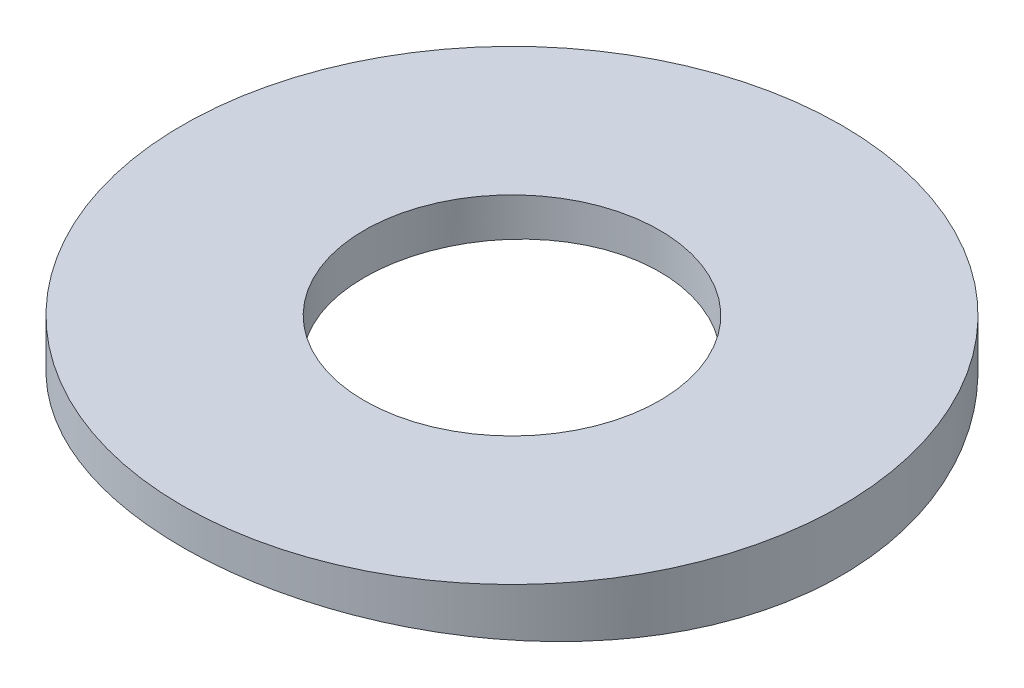
ISO-10303-21;
HEADER;
FILE_DESCRIPTION(('STEP AP214'),'2;1');
FILE_NAME('part.step','',(''),(''),'','','');
FILE_SCHEMA(('AUTOMOTIVE_DESIGN { 1 0 10303 214 1 1 1 1 }'));
ENDSEC;
DATA;
#1=APPLICATION_CONTEXT('core data for automotive mechanical design processes');
#2=APPLICATION_PROTOCOL_DEFINITION('international standard','automotive_design',2000,#1);
#3=PRODUCT_CONTEXT('',#1,'mechanical');
#4=PRODUCT('Part','Part','',(#3));
#5=PRODUCT_RELATED_PRODUCT_CATEGORY('part','',(#4));
#6=PRODUCT_DEFINITION_FORMATION('','',#4);
#7=PRODUCT_DEFINITION_CONTEXT('part definition',#1,'design');
#8=PRODUCT_DEFINITION('design','',#6,#7);
#9=PRODUCT_DEFINITION_SHAPE('','',#8);
#10=(LENGTH_UNIT() NAMED_UNIT(*) SI_UNIT(.MILLI.,.METRE.));
#11=(NAMED_UNIT(*) PLANE_ANGLE_UNIT() SI_UNIT($,.RADIAN.));
#12=(NAMED_UNIT(*) SI_UNIT($,.STERADIAN.) SOLID_ANGLE_UNIT());
#13=UNCERTAINTY_MEASURE_WITH_UNIT(LENGTH_MEASURE(1.E-05),#10,'distance_accuracy_value','');
#14=(GEOMETRIC_REPRESENTATION_CONTEXT(3) GLOBAL_UNCERTAINTY_ASSIGNED_CONTEXT((#13)) GLOBAL_UNIT_ASSIGNED_CONTEXT((#10,
#11,#12)) REPRESENTATION_CONTEXT('',''));
#15=CARTESIAN_POINT('',(0.,0.,0.));
#16=DIRECTION('',(0.,0.,1.));
#17=DIRECTION('',(1.,0.,0.));
#18=AXIS2_PLACEMENT_3D('',#15,#16,#17);
#19=CARTESIAN_POINT('',(0.,31.5,0.));
#20=DIRECTION('',(0.,-1.,0.));
#21=DIRECTION('',(0.,0.,-1.));
#22=AXIS2_PLACEMENT_3D('',#19,#20,#21);
#23=CYLINDRICAL_SURFACE('',#22,4.575);
#24=CARTESIAN_POINT('',(0.,31.5,0.));
#25=DIRECTION('',(0.,1.,0.));
#26=DIRECTION('',(0.,0.,1.));
#27=AXIS2_PLACEMENT_3D('',#24,#25,#26);
#28=CIRCLE('',#27,4.575);
#29=CARTESIAN_POINT('',(0.,31.5,4.575));
#30=VERTEX_POINT('',#29);
#31=EDGE_CURVE('E61',#30,#30,#28,.T.);
#32=ORIENTED_EDGE('',*,*,#31,.F.);
#33=EDGE_LOOP('',(#32));
#34=FACE_BOUND('',#33,.T.);
#35=CARTESIAN_POINT('',(0.,31.,-4.575));
#36=CARTESIAN_POINT('',(-0.2554910003045,30.9999959514671,-4.57498942727914));
#37=CARTESIAN_POINT('',(-0.511131445319186,30.9968083727082,-4.55352590453105));
#38=CARTESIAN_POINT('',(-1.01527014122844,30.9843992513034,-4.46825875179378));
#39=CARTESIAN_POINT('',(-1.26376113542093,30.9751717891014,-4.4044135836225));
#40=CARTESIAN_POINT('',(-1.74623180797945,30.9517201278143,-4.23632958735716));
#41=CARTESIAN_POINT('',(-1.9802221785734,30.9374996632285,-4.13212094299717));
#42=CARTESIAN_POINT('',(-2.42735841711655,30.9056344203031,-3.88634108468699));
#43=CARTESIAN_POINT('',(-2.64050724465526,30.8879901292268,-3.74477518622016));
#44=CARTESIAN_POINT('',(-3.04156047494433,30.851090760935,-3.42715686534273));
#45=CARTESIAN_POINT('',(-3.22928421145063,30.8318255877638,-3.25087746650293));
#46=CARTESIAN_POINT('',(-3.57259999407972,30.7939350267551,-2.86932443008993));
#47=CARTESIAN_POINT('',(-3.72819021529013,30.775309675304,-2.66404914690951));
#48=CARTESIAN_POINT('',(-4.00352263014604,30.7407095196694,-2.22912139014033));
#49=CARTESIAN_POINT('',(-4.12309057374814,30.724747760773,-1.99935747923341));
#50=CARTESIAN_POINT('',(-4.3218708640237,30.6974194624581,-1.52273370577321));
#51=CARTESIAN_POINT('',(-4.40108533921677,30.6860526806753,-1.27587474571085));
#52=CARTESIAN_POINT('',(-4.51635018627481,30.6693003320747,-0.773966020862406));
#53=CARTESIAN_POINT('',(-4.55270946203933,30.6638719812145,-0.518988650756318));
#54=CARTESIAN_POINT('',(-4.58218864584616,30.6594811293318,-0.00649832275634538));
#55=CARTESIAN_POINT('',(-4.57531095824467,30.6605182687711,0.251014493349298));
#56=CARTESIAN_POINT('',(-4.51876400602774,30.6689020858631,0.759086820297169));
#57=CARTESIAN_POINT('',(-4.46943838696208,30.6761980921386,1.0096855342892));
#58=CARTESIAN_POINT('',(-4.32993350258919,30.6961984265992,1.49901021244481));
#59=CARTESIAN_POINT('',(-4.23975311546973,30.7089029032925,1.7377358503913));
#60=CARTESIAN_POINT('',(-4.02073992924659,30.7383448329766,2.1975856894527));
#61=CARTESIAN_POINT('',(-3.89176117838949,30.755097466683,2.41863936621855));
#62=CARTESIAN_POINT('',(-3.59891648832446,30.790737064432,2.83609641158226));
#63=CARTESIAN_POINT('',(-3.43504833161624,30.8096241641011,3.03249821209477));
#64=CARTESIAN_POINT('',(-3.07518822254876,30.8476286254862,3.3970683359399));
#65=CARTESIAN_POINT('',(-2.87890073532812,30.8667464466931,3.56494503184529));
#66=CARTESIAN_POINT('',(-2.46078217750734,30.9028883783172,3.86541743511309));
#67=CARTESIAN_POINT('',(-2.2389510014331,30.9199124800886,3.99801299678639));
#68=CARTESIAN_POINT('',(-1.77579217284354,30.9499657902661,4.22417267729594));
#69=CARTESIAN_POINT('',(-1.5344535942218,30.9629927400001,4.31771473888214));
#70=CARTESIAN_POINT('',(-1.03925808416779,30.9835649384809,4.46286087993934));
#71=CARTESIAN_POINT('',(-0.78540197285658,30.9911105458448,4.51446770305229));
#72=CARTESIAN_POINT('',(-0.274894870116721,30.9998224717702,4.57389167934189));
#73=CARTESIAN_POINT('',(-0.0182915170781978,31.0010472074108,4.58210984397508));
#74=CARTESIAN_POINT('',(0.492629576607515,30.9971382773716,4.55558698867809));
#75=CARTESIAN_POINT('',(0.746947385453031,30.9920048020532,4.52084725488387));
#76=CARTESIAN_POINT('',(1.2448668502305,30.9759923981289,4.40972816928555));
#77=CARTESIAN_POINT('',(1.48851294885174,30.9651403743059,4.33354375369979));
#78=CARTESIAN_POINT('',(1.95957340578636,30.9389039241763,4.14190316617825));
#79=CARTESIAN_POINT('',(2.18698702246321,30.9235192909465,4.02644520128357));
#80=CARTESIAN_POINT('',(2.62089331422019,30.8897825938589,3.75859107938244));
#81=CARTESIAN_POINT('',(2.82722703825063,30.8714103565578,3.60594001928413));
#82=CARTESIAN_POINT('',(3.21149044715159,30.8338073415268,3.26838839389746));
#83=CARTESIAN_POINT('',(3.38941853574344,30.8145765156254,3.0834860174401));
#84=CARTESIAN_POINT('',(3.71327531393901,30.7772390360892,2.68489713512561));
#85=CARTESIAN_POINT('',(3.8589354926445,30.7591426529812,2.47099135409104));
#86=CARTESIAN_POINT('',(4.11225650038999,30.7263035784393,2.02151331596604));
#87=CARTESIAN_POINT('',(4.21991833007638,30.7115607986956,1.7859416296303));
#88=CARTESIAN_POINT('',(4.39376840573616,30.6871720916164,1.30062630958643));
#89=CARTESIAN_POINT('',(4.46009900246942,30.677508688369,1.05093458571281));
#90=CARTESIAN_POINT('',(4.54985739643946,30.6643260236724,0.543802286329639));
#91=CARTESIAN_POINT('',(4.57328805352877,30.6608063526623,0.286362228512805));
#92=CARTESIAN_POINT('',(4.57651504142164,30.6603246175224,-0.226283209634243));
#93=CARTESIAN_POINT('',(4.55673351670441,30.6632991110421,-0.481485973581096));
#94=CARTESIAN_POINT('',(4.47500118263479,30.6753328303599,-0.984893350049709));
#95=CARTESIAN_POINT('',(4.41305043235226,30.6843920476347,-1.23309797237383));
#96=CARTESIAN_POINT('',(4.24888572349468,30.7075525551431,-1.71535281673918));
#97=CARTESIAN_POINT('',(4.14670032588713,30.7216502680962,-1.94941294373971));
#98=CARTESIAN_POINT('',(3.90500888675399,30.7533038094898,-2.39713496874725));
#99=CARTESIAN_POINT('',(3.76550166327044,30.7708597474453,-2.61079622044431));
#100=CARTESIAN_POINT('',(3.45158942444308,30.8076559628315,-3.01380170721324));
#101=CARTESIAN_POINT('',(3.27687150885756,30.8269104037218,-3.2029009494146));
#102=CARTESIAN_POINT('',(2.89815849781536,30.8648151709598,-3.54924718410937));
#103=CARTESIAN_POINT('',(2.69415659822493,30.8834653556707,-3.70648675347512));
#104=CARTESIAN_POINT('',(2.2613923684426,30.9181732580888,-3.98539445352873));
#105=CARTESIAN_POINT('',(2.03250410608737,30.9342166584461,-4.1068689261941));
#106=CARTESIAN_POINT('',(1.55744703444295,30.9617626237764,-4.30946941217388));
#107=CARTESIAN_POINT('',(1.31129652152327,30.9732699134193,-4.39063743043832));
#108=CARTESIAN_POINT('',(0.886686189888459,30.9878048786693,-4.49180012975829));
#109=CARTESIAN_POINT('',(0.71085373370944,30.9923546896523,-4.52295270070283));
#110=CARTESIAN_POINT('',(0.356705117409544,30.9984536459428,-4.56455620435037));
#111=CARTESIAN_POINT('',(0.17838898671211,31.0000028267676,-4.57500738208766));
#112=CARTESIAN_POINT('',(0.,31.,-4.575));
#113=B_SPLINE_CURVE_WITH_KNOTS('',3,(#35,#36,#37,#38,#39,#40,#41,#42,#43,#44,#45,#46,#47,#48,
#49,#50,#51,#52,#53,#54,#55,#56,#57,#58,#59,#60,#61,#62,#63,#64,#65,#66,#67,#68,#69,#70,#71,#72,
#73,#74,#75,#76,#77,#78,#79,#80,#81,#82,#83,#84,#85,#86,#87,#88,#89,#90,#91,#92,#93,#94,#95,#96,
#97,#98,#99,#100,#101,#102,#103,#104,#105,#106,#107,#108,#109,#110,#111,#112),.UNSPECIFIED.,.T.,
.F.,(4,2,2,2,2,2,2,2,2,2,2,2,2,2,2,2,2,2,2,2,2,2,2,2,2,2,2,2,2,2,2,2,2,2,2,2,2,2,4),(0.,
0.76582117544931,1.53239404138176,2.29839476880629,3.06428656234827,3.83536323258159,
4.60648368142539,5.38127648413811,6.15602841471425,6.92516103606037,7.69425088723303,
8.45717237380156,9.22011481034904,9.98596395973874,10.7518617994945,11.525171714488,
12.2984848227203,13.0722341059569,13.8459327620353,14.6124679751197,15.3789802391152,
16.1419179767005,16.9048905494271,17.6732469922017,18.4416465982279,19.2162182774855,
19.9907695576939,20.7626382081474,21.5344554013981,22.2987663752704,23.0630762785122,
23.8268446040351,24.5906371204686,25.3615427619368,26.1326278141354,26.9078143703303,
27.6821913696349,28.216909541329,28.7516213837354),.UNSPECIFIED.);
#114=CARTESIAN_POINT('',(0.,31.,-4.575));
#115=VERTEX_POINT('',#114);
#116=EDGE_CURVE('E10',#115,#115,#113,.T.);
#117=ORIENTED_EDGE('',*,*,#116,.T.);
#118=EDGE_LOOP('',(#117));
#119=FACE_BOUND('',#118,.T.);
#120=ADVANCED_FACE('F47',(#34,#119),#23,.T.);
#121=CARTESIAN_POINT('',(0.,31.5,0.));
#122=DIRECTION('',(0.,1.,0.));
#123=DIRECTION('',(0.,0.,1.));
#124=AXIS2_PLACEMENT_3D('',#121,#122,#123);
#125=PLANE('',#124);
#126=CARTESIAN_POINT('',(0.,31.5,0.));
#127=DIRECTION('',(0.,1.,0.));
#128=DIRECTION('',(0.,0.,1.));
#129=AXIS2_PLACEMENT_3D('',#126,#127,#128);
#130=CIRCLE('',#129,2.05);
#131=CARTESIAN_POINT('',(0.,31.5,2.05));
#132=VERTEX_POINT('',#131);
#133=EDGE_CURVE('E68',#132,#132,#130,.T.);
#134=ORIENTED_EDGE('',*,*,#133,.F.);
#135=EDGE_LOOP('',(#134));
#136=FACE_BOUND('',#135,.T.);
#137=ORIENTED_EDGE('',*,*,#31,.T.);
#138=EDGE_LOOP('',(#137));
#139=FACE_BOUND('',#138,.T.);
#140=ADVANCED_FACE('F78',(#136,#139),#125,.T.);
#141=CARTESIAN_POINT('',(0.,0.,-4.575));
#142=DIRECTION('',(0.,0.,1.));
#143=DIRECTION('',(1.,0.,0.));
#144=AXIS2_PLACEMENT_3D('',#141,#142,#143);
#145=CYLINDRICAL_SURFACE('',#144,31.);
#146=CARTESIAN_POINT('',(0.,31.,2.05));
#147=CARTESIAN_POINT('',(0.11501455880049,30.9999991008757,2.04999494470167));
#148=CARTESIAN_POINT('',(0.230109307011351,30.9993530766339,2.04028819002266));
#149=CARTESIAN_POINT('',(0.457119790778304,30.9968380664879,2.00170589922599));
#150=CARTESIAN_POINT('',(0.569031684379498,30.9949676630199,1.97280814355729));
#151=CARTESIAN_POINT('',(0.786355408695936,30.9902154522158,1.89667836471327));
#152=CARTESIAN_POINT('',(0.891770671941916,30.9873341844559,1.84945612130809));
#153=CARTESIAN_POINT('',(1.09315123749258,30.9808841617825,1.73803395018302));
#154=CARTESIAN_POINT('',(1.18911867522083,30.9773155627632,1.67383787108235));
#155=CARTESIAN_POINT('',(1.36906588840227,30.9698852763245,1.53017395233868));
#156=CARTESIAN_POINT('',(1.45302789550881,30.9660231671792,1.4506838767879));
#157=CARTESIAN_POINT('',(1.60642881818263,30.9584447323024,1.27873448929213));
#158=CARTESIAN_POINT('',(1.67586712224877,30.9547284127145,1.18627463154548));
#159=CARTESIAN_POINT('',(1.79830546976372,30.9478573558154,0.990908137812628));
#160=CARTESIAN_POINT('',(1.85129056714963,30.944703130211,0.887992115421215));
#161=CARTESIAN_POINT('',(1.93922285297929,30.9393174892298,0.674700436500219));
#162=CARTESIAN_POINT('',(1.97417025444772,30.9370860629549,0.564324868085074));
#163=CARTESIAN_POINT('',(2.02498531560555,30.9338017172236,0.339419982831862));
#164=CARTESIAN_POINT('',(2.04088106133683,30.9327470631229,0.224897037501003));
#165=CARTESIAN_POINT('',(2.05322830138958,30.9319300034307,-0.00519604514331049));
#166=CARTESIAN_POINT('',(2.049680038122,30.9321675817287,-0.120766169383518));
#167=CARTESIAN_POINT('',(2.02326327160709,30.9339065850469,-0.349481454435292));
#168=CARTESIAN_POINT('',(2.0004251807948,30.9354060206032,-0.462630145133262));
#169=CARTESIAN_POINT('',(1.93612423291307,30.9394966357437,-0.683484471054567));
#170=CARTESIAN_POINT('',(1.89466125337955,30.9420878225065,-0.791190070482811));
#171=CARTESIAN_POINT('',(1.79425305717886,30.9480722289179,-0.998198433394656));
#172=CARTESIAN_POINT('',(1.73529406782164,30.9514660799873,-1.09749449752249));
#173=CARTESIAN_POINT('',(1.60157745266774,30.9586727380437,-1.28479189494925));
#174=CARTESIAN_POINT('',(1.52681962734306,30.9624855503217,-1.37279308557943));
#175=CARTESIAN_POINT('',(1.36345626247692,30.9701093028232,-1.53517963243204));
#176=CARTESIAN_POINT('',(1.27482440721175,30.9739202253923,-1.60953851803788));
#177=CARTESIAN_POINT('',(1.08632110083942,30.9811037185636,-1.74232542457822));
#178=CARTESIAN_POINT('',(0.986449645350404,30.9844762889948,-1.8007534393019));
#179=CARTESIAN_POINT('',(0.77828589050213,30.9904033679038,-1.90001789766522));
#180=CARTESIAN_POINT('',(0.669993099167028,30.9929578285429,-1.94085331262946));
#181=CARTESIAN_POINT('',(0.448067990111907,30.9969602178818,-2.00375559075384));
#182=CARTESIAN_POINT('',(0.334435742207698,30.9984081610456,-2.02582269924605));
#183=CARTESIAN_POINT('',(0.105286955680417,31.0000324968227,-2.05052910057569));
#184=CARTESIAN_POINT('',(-0.0102256213624804,31.0002112844107,-2.05320498604201));
#185=CARTESIAN_POINT('',(-0.240057949626237,30.9992835371937,-2.03914863187696));
#186=CARTESIAN_POINT('',(-0.3543777078036,30.998177009889,-2.02241650549676));
#187=CARTESIAN_POINT('',(-0.57847600275397,30.9948047215235,-1.9700493947536));
#188=CARTESIAN_POINT('',(-0.688258485729511,30.9925399917369,-1.93443122566273));
#189=CARTESIAN_POINT('',(-0.900287775610134,30.9871060283781,-1.84532019150623));
#190=CARTESIAN_POINT('',(-1.00253450671351,30.9839367857089,-1.79182714666815));
#191=CARTESIAN_POINT('',(-1.19675729405963,30.977043804002,-1.66839186438793));
#192=CARTESIAN_POINT('',(-1.28871780796917,30.9733192451807,-1.59842521787902));
#193=CARTESIAN_POINT('',(-1.45960121229114,30.9657374361378,-1.44406431585504));
#194=CARTESIAN_POINT('',(-1.53852395937129,30.9618801844582,-1.3596699017473));
#195=CARTESIAN_POINT('',(-1.68121570043752,30.9544607651143,-1.17869109587687));
#196=CARTESIAN_POINT('',(-1.74496093320357,30.9508990657584,-1.08208794788956));
#197=CARTESIAN_POINT('',(-1.85532556018696,30.9444798989167,-0.879528009812929));
#198=CARTESIAN_POINT('',(-1.90194507021619,30.9416224266687,-0.773571282982751));
#199=CARTESIAN_POINT('',(-1.9766938509989,30.936937350556,-0.555398290679001));
#200=CARTESIAN_POINT('',(-2.00483801383605,30.9351089174026,-0.44318714594419));
#201=CARTESIAN_POINT('',(-2.0418858047996,30.9326858255642,-0.215619605459491));
#202=CARTESIAN_POINT('',(-2.05078965114157,30.9320911528864,-0.100263245396339));
#203=CARTESIAN_POINT('',(-2.04910190518793,30.9322029854008,0.130083948259468));
#204=CARTESIAN_POINT('',(-2.03854766455747,30.9329069976441,0.245075058598639));
#205=CARTESIAN_POINT('',(-1.9983208508572,30.9355315846228,0.471648451029819));
#206=CARTESIAN_POINT('',(-1.96864824384889,30.9374521615179,0.583230727070174));
#207=CARTESIAN_POINT('',(-1.89103558665927,30.9422928341493,0.799824126689561));
#208=CARTESIAN_POINT('',(-1.84309577951083,30.9452129165878,0.90483533767058));
#209=CARTESIAN_POINT('',(-1.73031447574914,30.9517235113966,1.10532364798385));
#210=CARTESIAN_POINT('',(-1.66547339024614,30.9553140074589,1.20080097914207));
#211=CARTESIAN_POINT('',(-1.52059140319401,30.9627689012987,1.37970113807988));
#212=CARTESIAN_POINT('',(-1.44052333772413,30.9666337807161,1.46310194652988));
#213=CARTESIAN_POINT('',(-1.26749978530111,30.9741977503311,1.61530848175224));
#214=CARTESIAN_POINT('',(-1.17454115556967,30.9778967998068,1.68411063892558));
#215=CARTESIAN_POINT('',(-0.978258323872943,30.9847165601945,1.8052237445489));
#216=CARTESIAN_POINT('',(-0.874920487613127,30.9878364946453,1.85751261735809));
#217=CARTESIAN_POINT('',(-0.660986084139322,30.9931363205371,1.94393329894286));
#218=CARTESIAN_POINT('',(-0.550398164618799,30.9953173092386,1.97808631241016));
#219=CARTESIAN_POINT('',(-0.365947739726476,30.9979237438523,2.01841649341409));
#220=CARTESIAN_POINT('',(-0.293276640034188,30.9986988667848,2.03024492826747));
#221=CARTESIAN_POINT('',(-0.147081292320198,30.9997372819733,2.0460382919483));
#222=CARTESIAN_POINT('',(-0.0735570456350749,31.0000005750309,2.05000323309339));
#223=CARTESIAN_POINT('',(0.,31.,2.05));
#224=B_SPLINE_CURVE_WITH_KNOTS('',3,(#146,#147,#148,#149,#150,#151,#152,#153,#154,#155,#156,
#157,#158,#159,#160,#161,#162,#163,#164,#165,#166,#167,#168,#169,#170,#171,#172,#173,#174,#175,
#176,#177,#178,#179,#180,#181,#182,#183,#184,#185,#186,#187,#188,#189,#190,#191,#192,#193,#194,
#195,#196,#197,#198,#199,#200,#201,#202,#203,#204,#205,#206,#207,#208,#209,#210,#211,#212,#213,
#214,#215,#216,#217,#218,#219,#220,#221,#222,#223),.UNSPECIFIED.,.T.,.F.,(4,2,2,2,2,2,2,2,2,2,2,
2,2,2,2,2,2,2,2,2,2,2,2,2,2,2,2,2,2,2,2,2,2,2,2,2,2,2,4),(0.,0.344775143983662,
0.689950169978108,1.03494122903553,1.37985413237435,1.72527234587178,2.07070509981584,
2.41645073244504,2.76219228173473,3.1074235077784,3.45265042979024,3.79733407916008,
4.1420199949585,4.48697796722356,4.83194029632153,5.17756504720531,5.52318993283414,
5.86883502511698,6.21447559919079,6.55946375444702,6.90444989661108,7.24912939333278,
7.59381235669319,7.93900928974853,8.28421001751592,8.62994767356862,8.97568299154391,
9.32113928569456,9.66659166180482,10.0113815992701,10.3561721488003,10.700958111283,
11.0457356879019,11.3911341944382,11.7366170592452,12.0825598436857,12.4280972515515,
12.6485969951508,12.8690963933516),.UNSPECIFIED.);
#225=CARTESIAN_POINT('',(0.,31.,2.05));
#226=VERTEX_POINT('',#225);
#227=EDGE_CURVE('E51',#226,#226,#224,.T.);
#228=ORIENTED_EDGE('',*,*,#227,.T.);
#229=EDGE_LOOP('',(#228));
#230=FACE_BOUND('',#229,.T.);
#231=ORIENTED_EDGE('',*,*,#116,.F.);
#232=EDGE_LOOP('',(#231));
#233=FACE_BOUND('',#232,.T.);
#234=ADVANCED_FACE('F74',(#230,#233),#145,.F.);
#235=CARTESIAN_POINT('',(0.,30.3988299813007,0.));
#236=DIRECTION('',(0.,1.,0.));
#237=DIRECTION('',(0.,0.,1.));
#238=AXIS2_PLACEMENT_3D('',#235,#236,#237);
#239=CYLINDRICAL_SURFACE('',#238,2.05);
#240=ORIENTED_EDGE('',*,*,#133,.T.);
#241=EDGE_LOOP('',(#240));
#242=FACE_BOUND('',#241,.T.);
#243=ORIENTED_EDGE('',*,*,#227,.F.);
#244=EDGE_LOOP('',(#243));
#245=FACE_BOUND('',#244,.T.);
#246=ADVANCED_FACE('F77',(#242,#245),#239,.F.);
#247=CLOSED_SHELL('',(#120,#140,#234,#246));
#248=MANIFOLD_SOLID_BREP('B2',#247);
#249=ADVANCED_BREP_SHAPE_REPRESENTATION('',(#18,#248),#14);
#250=SHAPE_DEFINITION_REPRESENTATION(#9,#249);
ENDSEC;
END-ISO-10303-21;
